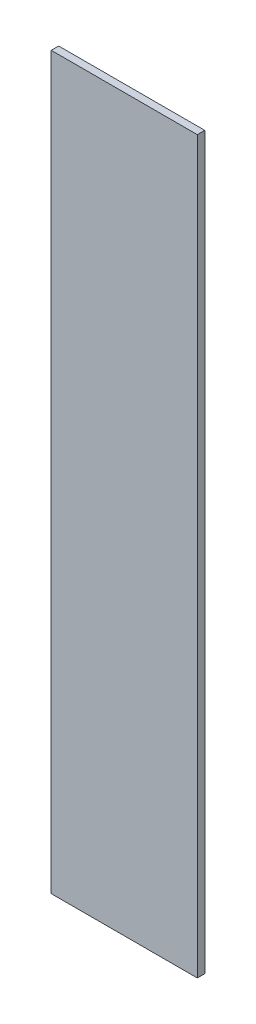
ISO-10303-21;
HEADER;
FILE_DESCRIPTION(('STEP AP214'),'2;1');
FILE_NAME('part.step','',(''),(''),'','','');
FILE_SCHEMA(('AUTOMOTIVE_DESIGN { 1 0 10303 214 1 1 1 1 }'));
ENDSEC;
DATA;
#1=APPLICATION_CONTEXT('core data for automotive mechanical design processes');
#2=APPLICATION_PROTOCOL_DEFINITION('international standard','automotive_design',2000,#1);
#3=PRODUCT_CONTEXT('',#1,'mechanical');
#4=PRODUCT('Part','Part','',(#3));
#5=PRODUCT_RELATED_PRODUCT_CATEGORY('part','',(#4));
#6=PRODUCT_DEFINITION_FORMATION('','',#4);
#7=PRODUCT_DEFINITION_CONTEXT('part definition',#1,'design');
#8=PRODUCT_DEFINITION('design','',#6,#7);
#9=PRODUCT_DEFINITION_SHAPE('','',#8);
#10=(LENGTH_UNIT() NAMED_UNIT(*) SI_UNIT(.MILLI.,.METRE.));
#11=(NAMED_UNIT(*) PLANE_ANGLE_UNIT() SI_UNIT($,.RADIAN.));
#12=(NAMED_UNIT(*) SI_UNIT($,.STERADIAN.) SOLID_ANGLE_UNIT());
#13=UNCERTAINTY_MEASURE_WITH_UNIT(LENGTH_MEASURE(1.E-05),#10,'distance_accuracy_value','');
#14=(GEOMETRIC_REPRESENTATION_CONTEXT(3) GLOBAL_UNCERTAINTY_ASSIGNED_CONTEXT((#13)) GLOBAL_UNIT_ASSIGNED_CONTEXT((#10,
#11,#12)) REPRESENTATION_CONTEXT('',''));
#15=CARTESIAN_POINT('',(0.,0.,0.));
#16=DIRECTION('',(0.,0.,1.));
#17=DIRECTION('',(1.,0.,0.));
#18=AXIS2_PLACEMENT_3D('',#15,#16,#17);
#19=CARTESIAN_POINT('',(2.5,0.,0.));
#20=DIRECTION('',(0.,0.,1.));
#21=DIRECTION('',(1.,0.,0.));
#22=AXIS2_PLACEMENT_3D('',#19,#20,#21);
#23=PLANE('',#22);
#24=DIRECTION('',(0.,1.,0.));
#25=VECTOR('',#24,1.);
#26=CARTESIAN_POINT('',(-2.5,0.,0.));
#27=LINE('',#26,#25);
#28=CARTESIAN_POINT('',(-2.5,0.,0.));
#29=VERTEX_POINT('',#28);
#30=CARTESIAN_POINT('',(-2.5,25.,0.));
#31=VERTEX_POINT('',#30);
#32=EDGE_CURVE('E102',#29,#31,#27,.T.);
#33=ORIENTED_EDGE('',*,*,#32,.T.);
#34=DIRECTION('',(-1.,0.,0.));
#35=VECTOR('',#34,1.);
#36=CARTESIAN_POINT('',(2.5,25.,0.));
#37=LINE('',#36,#35);
#38=CARTESIAN_POINT('',(2.5,25.,0.));
#39=VERTEX_POINT('',#38);
#40=EDGE_CURVE('E11',#39,#31,#37,.T.);
#41=ORIENTED_EDGE('',*,*,#40,.F.);
#42=DIRECTION('',(0.,1.,0.));
#43=VECTOR('',#42,1.);
#44=CARTESIAN_POINT('',(2.5,0.,0.));
#45=LINE('',#44,#43);
#46=CARTESIAN_POINT('',(2.5,0.,0.));
#47=VERTEX_POINT('',#46);
#48=EDGE_CURVE('E90',#47,#39,#45,.T.);
#49=ORIENTED_EDGE('',*,*,#48,.F.);
#50=DIRECTION('',(-1.,0.,0.));
#51=VECTOR('',#50,1.);
#52=CARTESIAN_POINT('',(2.5,0.,0.));
#53=LINE('',#52,#51);
#54=EDGE_CURVE('E98',#47,#29,#53,.T.);
#55=ORIENTED_EDGE('',*,*,#54,.T.);
#56=EDGE_LOOP('',(#33,#41,#49,#55));
#57=FACE_BOUND('',#56,.T.);
#58=ADVANCED_FACE('F39',(#57),#23,.F.);
#59=CARTESIAN_POINT('',(2.5,25.,0.));
#60=DIRECTION('',(0.,-1.,0.));
#61=DIRECTION('',(0.,0.,-1.));
#62=AXIS2_PLACEMENT_3D('',#59,#60,#61);
#63=PLANE('',#62);
#64=DIRECTION('',(0.,0.,1.));
#65=VECTOR('',#64,1.);
#66=CARTESIAN_POINT('',(-2.5,25.,0.));
#67=LINE('',#66,#65);
#68=CARTESIAN_POINT('',(-2.5,25.,0.255));
#69=VERTEX_POINT('',#68);
#70=EDGE_CURVE('E94',#31,#69,#67,.T.);
#71=ORIENTED_EDGE('',*,*,#70,.T.);
#72=DIRECTION('',(-1.,0.,0.));
#73=VECTOR('',#72,1.);
#74=CARTESIAN_POINT('',(2.5,25.,0.255));
#75=LINE('',#74,#73);
#76=CARTESIAN_POINT('',(2.5,25.,0.255));
#77=VERTEX_POINT('',#76);
#78=EDGE_CURVE('E47',#77,#69,#75,.T.);
#79=ORIENTED_EDGE('',*,*,#78,.F.);
#80=DIRECTION('',(0.,0.,1.));
#81=VECTOR('',#80,1.);
#82=CARTESIAN_POINT('',(2.5,25.,0.));
#83=LINE('',#82,#81);
#84=EDGE_CURVE('E85',#39,#77,#83,.T.);
#85=ORIENTED_EDGE('',*,*,#84,.F.);
#86=ORIENTED_EDGE('',*,*,#40,.T.);
#87=EDGE_LOOP('',(#71,#79,#85,#86));
#88=FACE_BOUND('',#87,.T.);
#89=ADVANCED_FACE('F93',(#88),#63,.F.);
#90=CARTESIAN_POINT('',(2.5,0.,0.255));
#91=DIRECTION('',(0.,0.,-1.));
#92=DIRECTION('',(-1.,0.,0.));
#93=AXIS2_PLACEMENT_3D('',#90,#91,#92);
#94=PLANE('',#93);
#95=DIRECTION('',(0.,-1.,0.));
#96=VECTOR('',#95,1.);
#97=CARTESIAN_POINT('',(-2.5,0.,0.255));
#98=LINE('',#97,#96);
#99=CARTESIAN_POINT('',(-2.5,0.,0.255));
#100=VERTEX_POINT('',#99);
#101=EDGE_CURVE('E72',#69,#100,#98,.T.);
#102=ORIENTED_EDGE('',*,*,#101,.T.);
#103=DIRECTION('',(-1.,0.,0.));
#104=VECTOR('',#103,1.);
#105=CARTESIAN_POINT('',(2.5,0.,0.255));
#106=LINE('',#105,#104);
#107=CARTESIAN_POINT('',(2.5,0.,0.255));
#108=VERTEX_POINT('',#107);
#109=EDGE_CURVE('E95',#108,#100,#106,.T.);
#110=ORIENTED_EDGE('',*,*,#109,.F.);
#111=DIRECTION('',(0.,-1.,0.));
#112=VECTOR('',#111,1.);
#113=CARTESIAN_POINT('',(2.5,0.,0.255));
#114=LINE('',#113,#112);
#115=EDGE_CURVE('E88',#77,#108,#114,.T.);
#116=ORIENTED_EDGE('',*,*,#115,.F.);
#117=ORIENTED_EDGE('',*,*,#78,.T.);
#118=EDGE_LOOP('',(#102,#110,#116,#117));
#119=FACE_BOUND('',#118,.T.);
#120=ADVANCED_FACE('F96',(#119),#94,.F.);
#121=CARTESIAN_POINT('',(2.5,0.,0.));
#122=DIRECTION('',(0.,1.,0.));
#123=DIRECTION('',(0.,0.,1.));
#124=AXIS2_PLACEMENT_3D('',#121,#122,#123);
#125=PLANE('',#124);
#126=DIRECTION('',(0.,0.,-1.));
#127=VECTOR('',#126,1.);
#128=CARTESIAN_POINT('',(-2.5,0.,0.));
#129=LINE('',#128,#127);
#130=EDGE_CURVE('E78',#100,#29,#129,.T.);
#131=ORIENTED_EDGE('',*,*,#130,.T.);
#132=ORIENTED_EDGE('',*,*,#54,.F.);
#133=DIRECTION('',(0.,0.,-1.));
#134=VECTOR('',#133,1.);
#135=CARTESIAN_POINT('',(2.5,0.,0.));
#136=LINE('',#135,#134);
#137=EDGE_CURVE('E55',#108,#47,#136,.T.);
#138=ORIENTED_EDGE('',*,*,#137,.F.);
#139=ORIENTED_EDGE('',*,*,#109,.T.);
#140=EDGE_LOOP('',(#131,#132,#138,#139));
#141=FACE_BOUND('',#140,.T.);
#142=ADVANCED_FACE('F109',(#141),#125,.F.);
#143=CARTESIAN_POINT('',(2.5,0.,0.));
#144=DIRECTION('',(1.,0.,0.));
#145=DIRECTION('',(0.,0.,-1.));
#146=AXIS2_PLACEMENT_3D('',#143,#144,#145);
#147=PLANE('',#146);
#148=ORIENTED_EDGE('',*,*,#48,.T.);
#149=ORIENTED_EDGE('',*,*,#84,.T.);
#150=ORIENTED_EDGE('',*,*,#115,.T.);
#151=ORIENTED_EDGE('',*,*,#137,.T.);
#152=EDGE_LOOP('',(#148,#149,#150,#151));
#153=FACE_BOUND('',#152,.T.);
#154=ADVANCED_FACE('F86',(#153),#147,.T.);
#155=CARTESIAN_POINT('',(-2.5,0.,0.));
#156=DIRECTION('',(1.,0.,0.));
#157=DIRECTION('',(0.,0.,-1.));
#158=AXIS2_PLACEMENT_3D('',#155,#156,#157);
#159=PLANE('',#158);
#160=ORIENTED_EDGE('',*,*,#32,.F.);
#161=ORIENTED_EDGE('',*,*,#130,.F.);
#162=ORIENTED_EDGE('',*,*,#101,.F.);
#163=ORIENTED_EDGE('',*,*,#70,.F.);
#164=EDGE_LOOP('',(#160,#161,#162,#163));
#165=FACE_BOUND('',#164,.T.);
#166=ADVANCED_FACE('F112',(#165),#159,.F.);
#167=CLOSED_SHELL('',(#58,#89,#120,#142,#154,#166));
#168=MANIFOLD_SOLID_BREP('B2',#167);
#169=ADVANCED_BREP_SHAPE_REPRESENTATION('',(#18,#168),#14);
#170=SHAPE_DEFINITION_REPRESENTATION(#9,#169);
ENDSEC;
END-ISO-10303-21;
